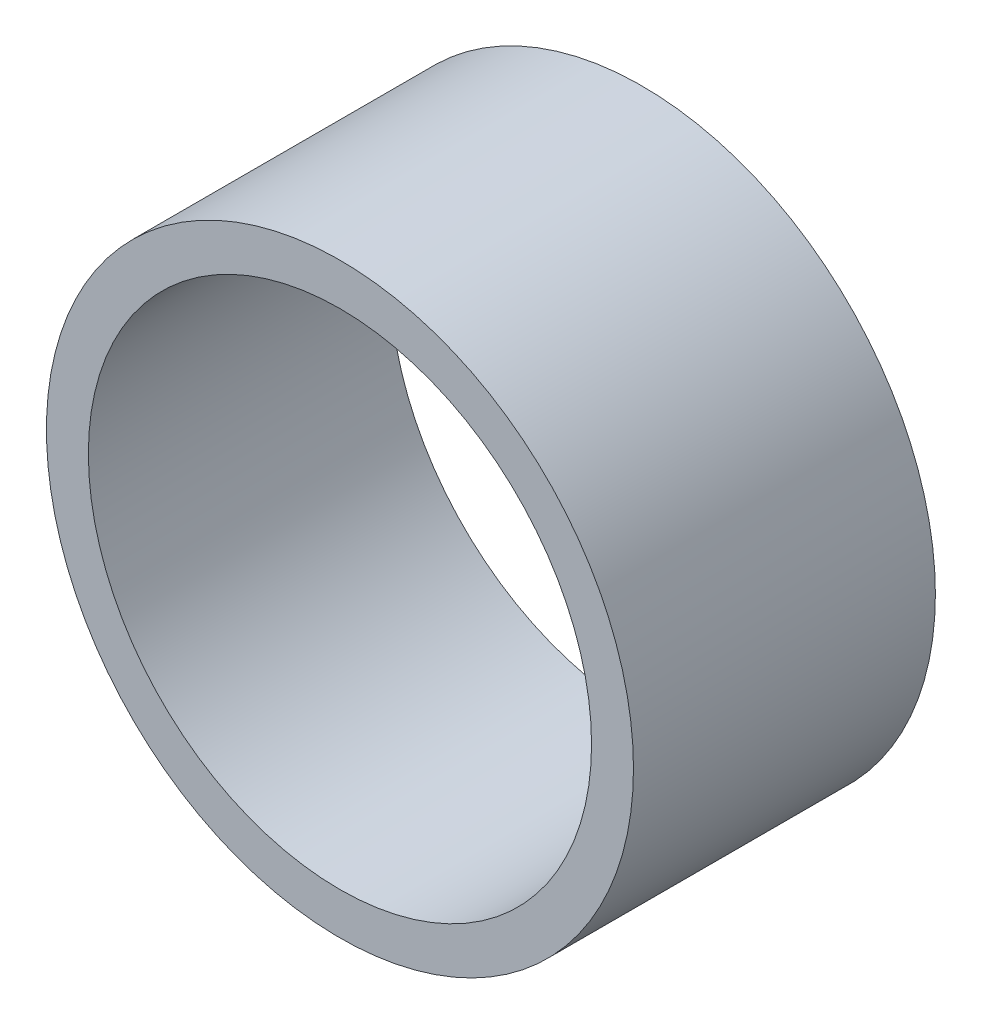
ISO-10303-21;
HEADER;
FILE_DESCRIPTION(('STEP AP214'),'2;1');
FILE_NAME('part.step','',(''),(''),'','','');
FILE_SCHEMA(('AUTOMOTIVE_DESIGN { 1 0 10303 214 1 1 1 1 }'));
ENDSEC;
DATA;
#1=APPLICATION_CONTEXT('core data for automotive mechanical design processes');
#2=APPLICATION_PROTOCOL_DEFINITION('international standard','automotive_design',2000,#1);
#3=PRODUCT_CONTEXT('',#1,'mechanical');
#4=PRODUCT('Part','Part','',(#3));
#5=PRODUCT_RELATED_PRODUCT_CATEGORY('part','',(#4));
#6=PRODUCT_DEFINITION_FORMATION('','',#4);
#7=PRODUCT_DEFINITION_CONTEXT('part definition',#1,'design');
#8=PRODUCT_DEFINITION('design','',#6,#7);
#9=PRODUCT_DEFINITION_SHAPE('','',#8);
#10=(LENGTH_UNIT() NAMED_UNIT(*) SI_UNIT(.MILLI.,.METRE.));
#11=(NAMED_UNIT(*) PLANE_ANGLE_UNIT() SI_UNIT($,.RADIAN.));
#12=(NAMED_UNIT(*) SI_UNIT($,.STERADIAN.) SOLID_ANGLE_UNIT());
#13=UNCERTAINTY_MEASURE_WITH_UNIT(LENGTH_MEASURE(1.E-05),#10,'distance_accuracy_value','');
#14=(GEOMETRIC_REPRESENTATION_CONTEXT(3) GLOBAL_UNCERTAINTY_ASSIGNED_CONTEXT((#13)) GLOBAL_UNIT_ASSIGNED_CONTEXT((#10,
#11,#12)) REPRESENTATION_CONTEXT('',''));
#15=CARTESIAN_POINT('',(0.,0.,0.));
#16=DIRECTION('',(0.,0.,1.));
#17=DIRECTION('',(1.,0.,0.));
#18=AXIS2_PLACEMENT_3D('',#15,#16,#17);
#19=CARTESIAN_POINT('',(0.,0.,27.));
#20=DIRECTION('',(0.,0.,1.));
#21=DIRECTION('',(1.,0.,0.));
#22=AXIS2_PLACEMENT_3D('',#19,#20,#21);
#23=PLANE('',#22);
#24=CARTESIAN_POINT('',(0.,0.,27.));
#25=DIRECTION('',(0.,0.,1.));
#26=DIRECTION('',(1.,0.,0.));
#27=AXIS2_PLACEMENT_3D('',#24,#25,#26);
#28=CIRCLE('',#27,52.5);
#29=CARTESIAN_POINT('',(52.5,0.,27.));
#30=VERTEX_POINT('',#29);
#31=EDGE_CURVE('E10',#30,#30,#28,.T.);
#32=ORIENTED_EDGE('',*,*,#31,.T.);
#33=EDGE_LOOP('',(#32));
#34=FACE_BOUND('',#33,.T.);
#35=CARTESIAN_POINT('',(0.,0.,27.));
#36=DIRECTION('',(0.,0.,1.));
#37=DIRECTION('',(1.,0.,0.));
#38=AXIS2_PLACEMENT_3D('',#35,#36,#37);
#39=CIRCLE('',#38,45.);
#40=CARTESIAN_POINT('',(45.,0.,27.));
#41=VERTEX_POINT('',#40);
#42=EDGE_CURVE('E54',#41,#41,#39,.T.);
#43=ORIENTED_EDGE('',*,*,#42,.F.);
#44=EDGE_LOOP('',(#43));
#45=FACE_BOUND('',#44,.T.);
#46=ADVANCED_FACE('F41',(#34,#45),#23,.T.);
#47=CARTESIAN_POINT('',(0.,0.,-27.));
#48=DIRECTION('',(0.,0.,1.));
#49=DIRECTION('',(1.,0.,0.));
#50=AXIS2_PLACEMENT_3D('',#47,#48,#49);
#51=PLANE('',#50);
#52=CARTESIAN_POINT('',(0.,0.,-27.));
#53=DIRECTION('',(0.,0.,1.));
#54=DIRECTION('',(1.,0.,0.));
#55=AXIS2_PLACEMENT_3D('',#52,#53,#54);
#56=CIRCLE('',#55,52.5);
#57=CARTESIAN_POINT('',(52.5,0.,-27.));
#58=VERTEX_POINT('',#57);
#59=EDGE_CURVE('E45',#58,#58,#56,.T.);
#60=ORIENTED_EDGE('',*,*,#59,.F.);
#61=EDGE_LOOP('',(#60));
#62=FACE_BOUND('',#61,.T.);
#63=CARTESIAN_POINT('',(0.,0.,-27.));
#64=DIRECTION('',(0.,0.,1.));
#65=DIRECTION('',(1.,0.,0.));
#66=AXIS2_PLACEMENT_3D('',#63,#64,#65);
#67=CIRCLE('',#66,45.);
#68=CARTESIAN_POINT('',(45.,0.,-27.));
#69=VERTEX_POINT('',#68);
#70=EDGE_CURVE('E56',#69,#69,#67,.T.);
#71=ORIENTED_EDGE('',*,*,#70,.T.);
#72=EDGE_LOOP('',(#71));
#73=FACE_BOUND('',#72,.T.);
#74=ADVANCED_FACE('F68',(#62,#73),#51,.F.);
#75=CARTESIAN_POINT('',(0.,0.,27.));
#76=DIRECTION('',(0.,0.,-1.));
#77=DIRECTION('',(-1.,0.,0.));
#78=AXIS2_PLACEMENT_3D('',#75,#76,#77);
#79=CYLINDRICAL_SURFACE('',#78,52.5);
#80=ORIENTED_EDGE('',*,*,#31,.F.);
#81=EDGE_LOOP('',(#80));
#82=FACE_BOUND('',#81,.T.);
#83=ORIENTED_EDGE('',*,*,#59,.T.);
#84=EDGE_LOOP('',(#83));
#85=FACE_BOUND('',#84,.T.);
#86=ADVANCED_FACE('F43',(#82,#85),#79,.T.);
#87=CARTESIAN_POINT('',(0.,0.,27.));
#88=DIRECTION('',(0.,0.,-1.));
#89=DIRECTION('',(-1.,0.,0.));
#90=AXIS2_PLACEMENT_3D('',#87,#88,#89);
#91=CYLINDRICAL_SURFACE('',#90,45.);
#92=ORIENTED_EDGE('',*,*,#42,.T.);
#93=EDGE_LOOP('',(#92));
#94=FACE_BOUND('',#93,.T.);
#95=ORIENTED_EDGE('',*,*,#70,.F.);
#96=EDGE_LOOP('',(#95));
#97=FACE_BOUND('',#96,.T.);
#98=ADVANCED_FACE('F64',(#94,#97),#91,.F.);
#99=CLOSED_SHELL('',(#46,#74,#86,#98));
#100=MANIFOLD_SOLID_BREP('B2',#99);
#101=ADVANCED_BREP_SHAPE_REPRESENTATION('',(#18,#100),#14);
#102=SHAPE_DEFINITION_REPRESENTATION(#9,#101);
ENDSEC;
END-ISO-10303-21;
